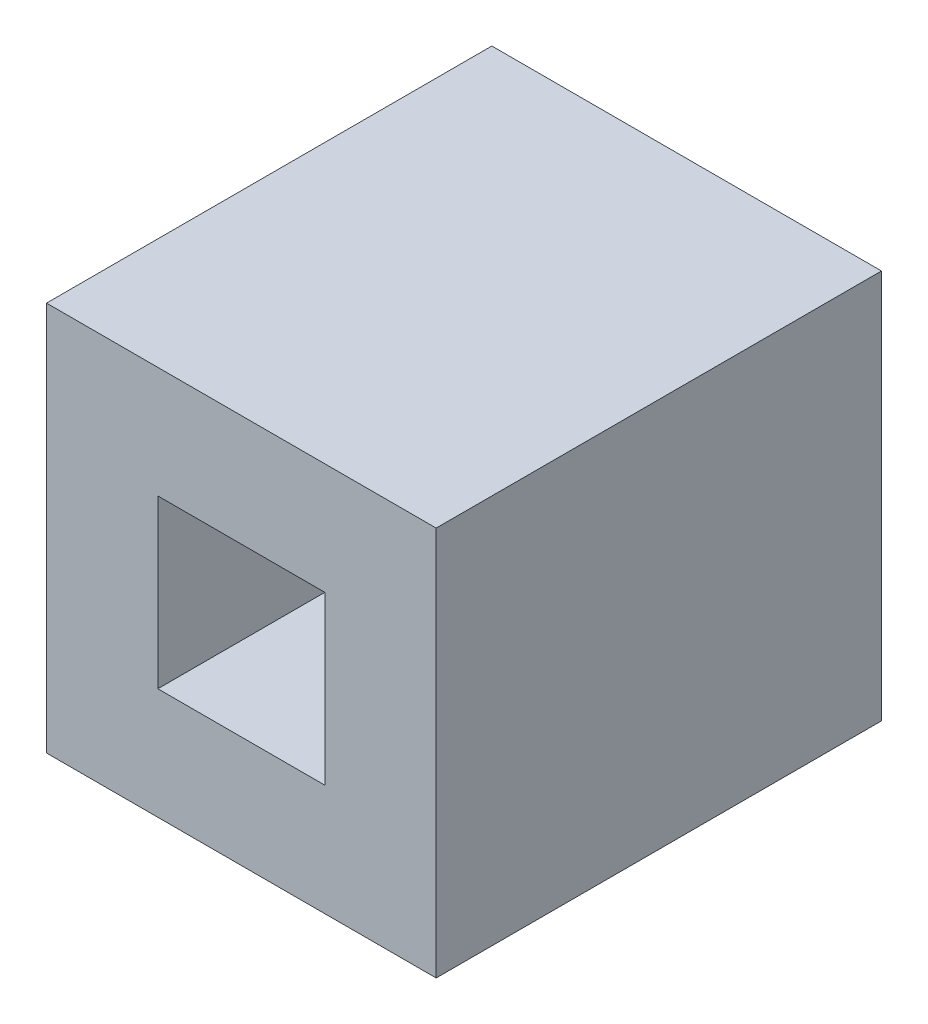
ISO-10303-21;
HEADER;
FILE_DESCRIPTION(('STEP AP214'),'2;1');
FILE_NAME('part.step','',(''),(''),'','','');
FILE_SCHEMA(('AUTOMOTIVE_DESIGN { 1 0 10303 214 1 1 1 1 }'));
ENDSEC;
DATA;
#1=APPLICATION_CONTEXT('core data for automotive mechanical design processes');
#2=APPLICATION_PROTOCOL_DEFINITION('international standard','automotive_design',2000,#1);
#3=PRODUCT_CONTEXT('',#1,'mechanical');
#4=PRODUCT('Part','Part','',(#3));
#5=PRODUCT_RELATED_PRODUCT_CATEGORY('part','',(#4));
#6=PRODUCT_DEFINITION_FORMATION('','',#4);
#7=PRODUCT_DEFINITION_CONTEXT('part definition',#1,'design');
#8=PRODUCT_DEFINITION('design','',#6,#7);
#9=PRODUCT_DEFINITION_SHAPE('','',#8);
#10=(LENGTH_UNIT() NAMED_UNIT(*) SI_UNIT(.MILLI.,.METRE.));
#11=(NAMED_UNIT(*) PLANE_ANGLE_UNIT() SI_UNIT($,.RADIAN.));
#12=(NAMED_UNIT(*) SI_UNIT($,.STERADIAN.) SOLID_ANGLE_UNIT());
#13=UNCERTAINTY_MEASURE_WITH_UNIT(LENGTH_MEASURE(1.E-05),#10,'distance_accuracy_value','');
#14=(GEOMETRIC_REPRESENTATION_CONTEXT(3) GLOBAL_UNCERTAINTY_ASSIGNED_CONTEXT((#13)) GLOBAL_UNIT_ASSIGNED_CONTEXT((#10,
#11,#12)) REPRESENTATION_CONTEXT('',''));
#15=CARTESIAN_POINT('',(0.,0.,0.));
#16=DIRECTION('',(0.,0.,1.));
#17=DIRECTION('',(1.,0.,0.));
#18=AXIS2_PLACEMENT_3D('',#15,#16,#17);
#19=CARTESIAN_POINT('',(0.,0.,40.));
#20=DIRECTION('',(0.,0.,-1.));
#21=DIRECTION('',(-1.,0.,0.));
#22=AXIS2_PLACEMENT_3D('',#19,#20,#21);
#23=PLANE('',#22);
#24=DIRECTION('',(0.,1.,0.));
#25=VECTOR('',#24,1.);
#26=CARTESIAN_POINT('',(17.5,-17.5,40.));
#27=LINE('',#26,#25);
#28=CARTESIAN_POINT('',(17.5,-17.5,40.));
#29=VERTEX_POINT('',#28);
#30=CARTESIAN_POINT('',(17.5,17.5,40.));
#31=VERTEX_POINT('',#30);
#32=EDGE_CURVE('E159',#29,#31,#27,.T.);
#33=ORIENTED_EDGE('',*,*,#32,.T.);
#34=DIRECTION('',(-1.,0.,0.));
#35=VECTOR('',#34,1.);
#36=CARTESIAN_POINT('',(-17.5,17.5,40.));
#37=LINE('',#36,#35);
#38=CARTESIAN_POINT('',(-17.5,17.5,40.));
#39=VERTEX_POINT('',#38);
#40=EDGE_CURVE('E162',#31,#39,#37,.T.);
#41=ORIENTED_EDGE('',*,*,#40,.T.);
#42=DIRECTION('',(0.,-1.,0.));
#43=VECTOR('',#42,1.);
#44=CARTESIAN_POINT('',(-17.5,-17.5,40.));
#45=LINE('',#44,#43);
#46=CARTESIAN_POINT('',(-17.5,-17.5,40.));
#47=VERTEX_POINT('',#46);
#48=EDGE_CURVE('E167',#39,#47,#45,.T.);
#49=ORIENTED_EDGE('',*,*,#48,.T.);
#50=DIRECTION('',(1.,0.,0.));
#51=VECTOR('',#50,1.);
#52=CARTESIAN_POINT('',(-17.5,-17.5,40.));
#53=LINE('',#52,#51);
#54=EDGE_CURVE('E169',#47,#29,#53,.T.);
#55=ORIENTED_EDGE('',*,*,#54,.T.);
#56=EDGE_LOOP('',(#33,#41,#49,#55));
#57=FACE_BOUND('',#56,.T.);
#58=DIRECTION('',(0.,1.,0.));
#59=VECTOR('',#58,1.);
#60=CARTESIAN_POINT('',(7.5,-7.5,40.));
#61=LINE('',#60,#59);
#62=CARTESIAN_POINT('',(7.5,-7.5,40.));
#63=VERTEX_POINT('',#62);
#64=CARTESIAN_POINT('',(7.5,7.5,40.));
#65=VERTEX_POINT('',#64);
#66=EDGE_CURVE('E112',#63,#65,#61,.T.);
#67=ORIENTED_EDGE('',*,*,#66,.F.);
#68=DIRECTION('',(1.,0.,0.));
#69=VECTOR('',#68,1.);
#70=CARTESIAN_POINT('',(-7.5,-7.5,40.));
#71=LINE('',#70,#69);
#72=CARTESIAN_POINT('',(-7.5,-7.5,40.));
#73=VERTEX_POINT('',#72);
#74=EDGE_CURVE('E140',#73,#63,#71,.T.);
#75=ORIENTED_EDGE('',*,*,#74,.F.);
#76=DIRECTION('',(0.,-1.,0.));
#77=VECTOR('',#76,1.);
#78=CARTESIAN_POINT('',(-7.5,-7.5,40.));
#79=LINE('',#78,#77);
#80=CARTESIAN_POINT('',(-7.5,7.5,40.));
#81=VERTEX_POINT('',#80);
#82=EDGE_CURVE('E133',#81,#73,#79,.T.);
#83=ORIENTED_EDGE('',*,*,#82,.F.);
#84=DIRECTION('',(-1.,0.,0.));
#85=VECTOR('',#84,1.);
#86=CARTESIAN_POINT('',(-7.5,7.5,40.));
#87=LINE('',#86,#85);
#88=EDGE_CURVE('E116',#65,#81,#87,.T.);
#89=ORIENTED_EDGE('',*,*,#88,.F.);
#90=EDGE_LOOP('',(#67,#75,#83,#89));
#91=FACE_BOUND('',#90,.T.);
#92=ADVANCED_FACE('F44',(#57,#91),#23,.F.);
#93=CARTESIAN_POINT('',(0.,0.,0.));
#94=DIRECTION('',(0.,0.,-1.));
#95=DIRECTION('',(-1.,0.,0.));
#96=AXIS2_PLACEMENT_3D('',#93,#94,#95);
#97=PLANE('',#96);
#98=DIRECTION('',(0.,1.,0.));
#99=VECTOR('',#98,1.);
#100=CARTESIAN_POINT('',(17.5,-17.5,0.));
#101=LINE('',#100,#99);
#102=CARTESIAN_POINT('',(17.5,-17.5,0.));
#103=VERTEX_POINT('',#102);
#104=CARTESIAN_POINT('',(17.5,17.5,0.));
#105=VERTEX_POINT('',#104);
#106=EDGE_CURVE('E129',#103,#105,#101,.T.);
#107=ORIENTED_EDGE('',*,*,#106,.F.);
#108=DIRECTION('',(1.,0.,0.));
#109=VECTOR('',#108,1.);
#110=CARTESIAN_POINT('',(-17.5,-17.5,0.));
#111=LINE('',#110,#109);
#112=CARTESIAN_POINT('',(-17.5,-17.5,0.));
#113=VERTEX_POINT('',#112);
#114=EDGE_CURVE('E165',#113,#103,#111,.T.);
#115=ORIENTED_EDGE('',*,*,#114,.F.);
#116=DIRECTION('',(0.,-1.,0.));
#117=VECTOR('',#116,1.);
#118=CARTESIAN_POINT('',(-17.5,-17.5,0.));
#119=LINE('',#118,#117);
#120=CARTESIAN_POINT('',(-17.5,17.5,0.));
#121=VERTEX_POINT('',#120);
#122=EDGE_CURVE('E179',#121,#113,#119,.T.);
#123=ORIENTED_EDGE('',*,*,#122,.F.);
#124=DIRECTION('',(-1.,0.,0.));
#125=VECTOR('',#124,1.);
#126=CARTESIAN_POINT('',(-17.5,17.5,0.));
#127=LINE('',#126,#125);
#128=EDGE_CURVE('E180',#105,#121,#127,.T.);
#129=ORIENTED_EDGE('',*,*,#128,.F.);
#130=EDGE_LOOP('',(#107,#115,#123,#129));
#131=FACE_BOUND('',#130,.T.);
#132=DIRECTION('',(1.,0.,0.));
#133=VECTOR('',#132,1.);
#134=CARTESIAN_POINT('',(-7.5,-7.5,0.));
#135=LINE('',#134,#133);
#136=CARTESIAN_POINT('',(-7.5,-7.5,0.));
#137=VERTEX_POINT('',#136);
#138=CARTESIAN_POINT('',(7.5,-7.5,0.));
#139=VERTEX_POINT('',#138);
#140=EDGE_CURVE('E123',#137,#139,#135,.T.);
#141=ORIENTED_EDGE('',*,*,#140,.T.);
#142=DIRECTION('',(0.,1.,0.));
#143=VECTOR('',#142,1.);
#144=CARTESIAN_POINT('',(7.5,-7.5,0.));
#145=LINE('',#144,#143);
#146=CARTESIAN_POINT('',(7.5,7.5,0.));
#147=VERTEX_POINT('',#146);
#148=EDGE_CURVE('E69',#139,#147,#145,.T.);
#149=ORIENTED_EDGE('',*,*,#148,.T.);
#150=DIRECTION('',(-1.,0.,0.));
#151=VECTOR('',#150,1.);
#152=CARTESIAN_POINT('',(-7.5,7.5,0.));
#153=LINE('',#152,#151);
#154=CARTESIAN_POINT('',(-7.5,7.5,0.));
#155=VERTEX_POINT('',#154);
#156=EDGE_CURVE('E130',#147,#155,#153,.T.);
#157=ORIENTED_EDGE('',*,*,#156,.T.);
#158=DIRECTION('',(0.,-1.,0.));
#159=VECTOR('',#158,1.);
#160=CARTESIAN_POINT('',(-7.5,-7.5,0.));
#161=LINE('',#160,#159);
#162=EDGE_CURVE('E147',#155,#137,#161,.T.);
#163=ORIENTED_EDGE('',*,*,#162,.T.);
#164=EDGE_LOOP('',(#141,#149,#157,#163));
#165=FACE_BOUND('',#164,.T.);
#166=ADVANCED_FACE('F201',(#131,#165),#97,.T.);
#167=CARTESIAN_POINT('',(17.5,-17.5,40.));
#168=DIRECTION('',(-1.,0.,0.));
#169=DIRECTION('',(0.,0.,1.));
#170=AXIS2_PLACEMENT_3D('',#167,#168,#169);
#171=PLANE('',#170);
#172=ORIENTED_EDGE('',*,*,#106,.T.);
#173=DIRECTION('',(0.,0.,-1.));
#174=VECTOR('',#173,1.);
#175=CARTESIAN_POINT('',(17.5,17.5,40.));
#176=LINE('',#175,#174);
#177=EDGE_CURVE('E11',#31,#105,#176,.T.);
#178=ORIENTED_EDGE('',*,*,#177,.F.);
#179=ORIENTED_EDGE('',*,*,#32,.F.);
#180=DIRECTION('',(0.,0.,-1.));
#181=VECTOR('',#180,1.);
#182=CARTESIAN_POINT('',(17.5,-17.5,40.));
#183=LINE('',#182,#181);
#184=EDGE_CURVE('E171',#29,#103,#183,.T.);
#185=ORIENTED_EDGE('',*,*,#184,.T.);
#186=EDGE_LOOP('',(#172,#178,#179,#185));
#187=FACE_BOUND('',#186,.T.);
#188=ADVANCED_FACE('F50',(#187),#171,.F.);
#189=CARTESIAN_POINT('',(-17.5,17.5,40.));
#190=DIRECTION('',(0.,-1.,0.));
#191=DIRECTION('',(0.,0.,-1.));
#192=AXIS2_PLACEMENT_3D('',#189,#190,#191);
#193=PLANE('',#192);
#194=ORIENTED_EDGE('',*,*,#128,.T.);
#195=DIRECTION('',(0.,0.,-1.));
#196=VECTOR('',#195,1.);
#197=CARTESIAN_POINT('',(-17.5,17.5,40.));
#198=LINE('',#197,#196);
#199=EDGE_CURVE('E53',#39,#121,#198,.T.);
#200=ORIENTED_EDGE('',*,*,#199,.F.);
#201=ORIENTED_EDGE('',*,*,#40,.F.);
#202=ORIENTED_EDGE('',*,*,#177,.T.);
#203=EDGE_LOOP('',(#194,#200,#201,#202));
#204=FACE_BOUND('',#203,.T.);
#205=ADVANCED_FACE('F211',(#204),#193,.F.);
#206=CARTESIAN_POINT('',(-17.5,-17.5,40.));
#207=DIRECTION('',(1.,0.,0.));
#208=DIRECTION('',(0.,0.,-1.));
#209=AXIS2_PLACEMENT_3D('',#206,#207,#208);
#210=PLANE('',#209);
#211=ORIENTED_EDGE('',*,*,#122,.T.);
#212=DIRECTION('',(0.,0.,-1.));
#213=VECTOR('',#212,1.);
#214=CARTESIAN_POINT('',(-17.5,-17.5,40.));
#215=LINE('',#214,#213);
#216=EDGE_CURVE('E187',#47,#113,#215,.T.);
#217=ORIENTED_EDGE('',*,*,#216,.F.);
#218=ORIENTED_EDGE('',*,*,#48,.F.);
#219=ORIENTED_EDGE('',*,*,#199,.T.);
#220=EDGE_LOOP('',(#211,#217,#218,#219));
#221=FACE_BOUND('',#220,.T.);
#222=ADVANCED_FACE('F199',(#221),#210,.F.);
#223=CARTESIAN_POINT('',(-17.5,-17.5,40.));
#224=DIRECTION('',(0.,1.,0.));
#225=DIRECTION('',(0.,0.,1.));
#226=AXIS2_PLACEMENT_3D('',#223,#224,#225);
#227=PLANE('',#226);
#228=ORIENTED_EDGE('',*,*,#114,.T.);
#229=ORIENTED_EDGE('',*,*,#184,.F.);
#230=ORIENTED_EDGE('',*,*,#54,.F.);
#231=ORIENTED_EDGE('',*,*,#216,.T.);
#232=EDGE_LOOP('',(#228,#229,#230,#231));
#233=FACE_BOUND('',#232,.T.);
#234=ADVANCED_FACE('F209',(#233),#227,.F.);
#235=CARTESIAN_POINT('',(7.5,-7.5,40.));
#236=DIRECTION('',(-1.,0.,0.));
#237=DIRECTION('',(0.,0.,1.));
#238=AXIS2_PLACEMENT_3D('',#235,#236,#237);
#239=PLANE('',#238);
#240=ORIENTED_EDGE('',*,*,#148,.F.);
#241=DIRECTION('',(0.,0.,-1.));
#242=VECTOR('',#241,1.);
#243=CARTESIAN_POINT('',(7.5,-7.5,40.));
#244=LINE('',#243,#242);
#245=EDGE_CURVE('E113',#63,#139,#244,.T.);
#246=ORIENTED_EDGE('',*,*,#245,.F.);
#247=ORIENTED_EDGE('',*,*,#66,.T.);
#248=DIRECTION('',(0.,0.,-1.));
#249=VECTOR('',#248,1.);
#250=CARTESIAN_POINT('',(7.5,7.5,40.));
#251=LINE('',#250,#249);
#252=EDGE_CURVE('E114',#65,#147,#251,.T.);
#253=ORIENTED_EDGE('',*,*,#252,.T.);
#254=EDGE_LOOP('',(#240,#246,#247,#253));
#255=FACE_BOUND('',#254,.T.);
#256=ADVANCED_FACE('F111',(#255),#239,.T.);
#257=CARTESIAN_POINT('',(-7.5,7.5,40.));
#258=DIRECTION('',(0.,-1.,0.));
#259=DIRECTION('',(0.,0.,-1.));
#260=AXIS2_PLACEMENT_3D('',#257,#258,#259);
#261=PLANE('',#260);
#262=ORIENTED_EDGE('',*,*,#156,.F.);
#263=ORIENTED_EDGE('',*,*,#252,.F.);
#264=ORIENTED_EDGE('',*,*,#88,.T.);
#265=DIRECTION('',(0.,0.,-1.));
#266=VECTOR('',#265,1.);
#267=CARTESIAN_POINT('',(-7.5,7.5,40.));
#268=LINE('',#267,#266);
#269=EDGE_CURVE('E127',#81,#155,#268,.T.);
#270=ORIENTED_EDGE('',*,*,#269,.T.);
#271=EDGE_LOOP('',(#262,#263,#264,#270));
#272=FACE_BOUND('',#271,.T.);
#273=ADVANCED_FACE('F125',(#272),#261,.T.);
#274=CARTESIAN_POINT('',(-7.5,-7.5,40.));
#275=DIRECTION('',(1.,0.,0.));
#276=DIRECTION('',(0.,0.,-1.));
#277=AXIS2_PLACEMENT_3D('',#274,#275,#276);
#278=PLANE('',#277);
#279=ORIENTED_EDGE('',*,*,#162,.F.);
#280=ORIENTED_EDGE('',*,*,#269,.F.);
#281=ORIENTED_EDGE('',*,*,#82,.T.);
#282=DIRECTION('',(0.,0.,-1.));
#283=VECTOR('',#282,1.);
#284=CARTESIAN_POINT('',(-7.5,-7.5,40.));
#285=LINE('',#284,#283);
#286=EDGE_CURVE('E63',#73,#137,#285,.T.);
#287=ORIENTED_EDGE('',*,*,#286,.T.);
#288=EDGE_LOOP('',(#279,#280,#281,#287));
#289=FACE_BOUND('',#288,.T.);
#290=ADVANCED_FACE('F237',(#289),#278,.T.);
#291=CARTESIAN_POINT('',(-7.5,-7.5,40.));
#292=DIRECTION('',(0.,1.,0.));
#293=DIRECTION('',(0.,0.,1.));
#294=AXIS2_PLACEMENT_3D('',#291,#292,#293);
#295=PLANE('',#294);
#296=ORIENTED_EDGE('',*,*,#140,.F.);
#297=ORIENTED_EDGE('',*,*,#286,.F.);
#298=ORIENTED_EDGE('',*,*,#74,.T.);
#299=ORIENTED_EDGE('',*,*,#245,.T.);
#300=EDGE_LOOP('',(#296,#297,#298,#299));
#301=FACE_BOUND('',#300,.T.);
#302=ADVANCED_FACE('F238',(#301),#295,.T.);
#303=CLOSED_SHELL('',(#92,#166,#188,#205,#222,#234,#256,#273,#290,#302));
#304=MANIFOLD_SOLID_BREP('B2',#303);
#305=ADVANCED_BREP_SHAPE_REPRESENTATION('',(#18,#304),#14);
#306=SHAPE_DEFINITION_REPRESENTATION(#9,#305);
ENDSEC;
END-ISO-10303-21;
